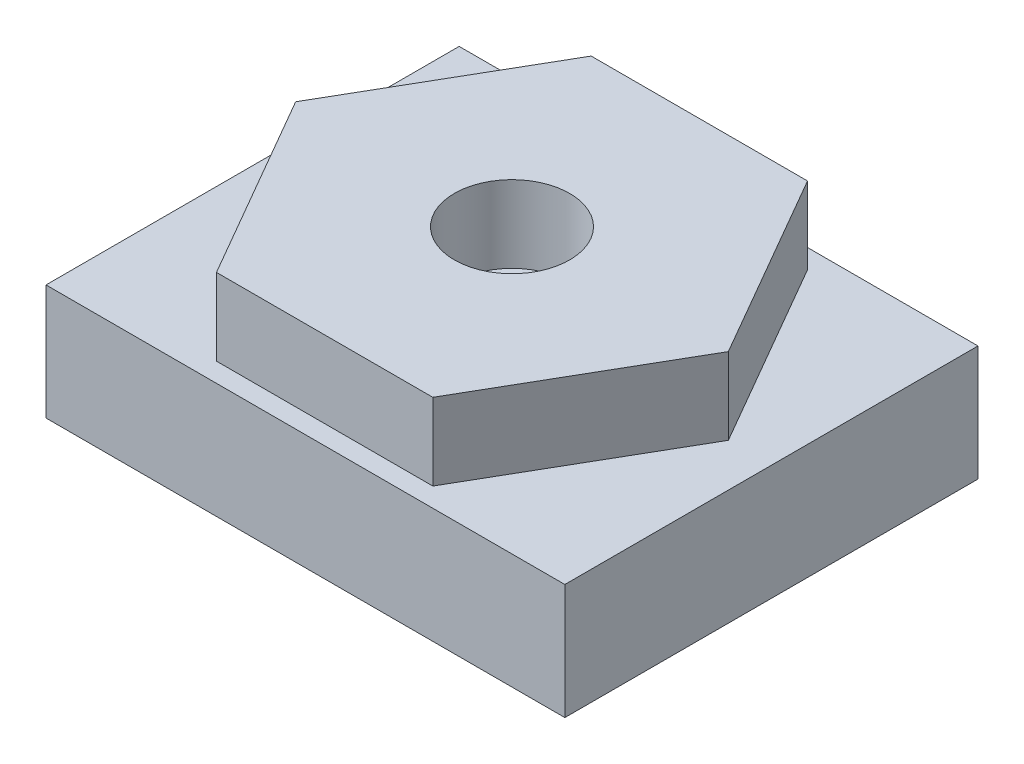
ISO-10303-21;
HEADER;
FILE_DESCRIPTION(('STEP AP214'),'2;1');
FILE_NAME('part.step','',(''),(''),'','','');
FILE_SCHEMA(('AUTOMOTIVE_DESIGN { 1 0 10303 214 1 1 1 1 }'));
ENDSEC;
DATA;
#1=APPLICATION_CONTEXT('core data for automotive mechanical design processes');
#2=APPLICATION_PROTOCOL_DEFINITION('international standard','automotive_design',2000,#1);
#3=PRODUCT_CONTEXT('',#1,'mechanical');
#4=PRODUCT('Part','Part','',(#3));
#5=PRODUCT_RELATED_PRODUCT_CATEGORY('part','',(#4));
#6=PRODUCT_DEFINITION_FORMATION('','',#4);
#7=PRODUCT_DEFINITION_CONTEXT('part definition',#1,'design');
#8=PRODUCT_DEFINITION('design','',#6,#7);
#9=PRODUCT_DEFINITION_SHAPE('','',#8);
#10=(LENGTH_UNIT() NAMED_UNIT(*) SI_UNIT(.MILLI.,.METRE.));
#11=(NAMED_UNIT(*) PLANE_ANGLE_UNIT() SI_UNIT($,.RADIAN.));
#12=(NAMED_UNIT(*) SI_UNIT($,.STERADIAN.) SOLID_ANGLE_UNIT());
#13=UNCERTAINTY_MEASURE_WITH_UNIT(LENGTH_MEASURE(1.E-05),#10,'distance_accuracy_value','');
#14=(GEOMETRIC_REPRESENTATION_CONTEXT(3) GLOBAL_UNCERTAINTY_ASSIGNED_CONTEXT((#13)) GLOBAL_UNIT_ASSIGNED_CONTEXT((#10,
#11,#12)) REPRESENTATION_CONTEXT('',''));
#15=CARTESIAN_POINT('',(0.,0.,0.));
#16=DIRECTION('',(0.,0.,1.));
#17=DIRECTION('',(1.,0.,0.));
#18=AXIS2_PLACEMENT_3D('',#15,#16,#17);
#19=CARTESIAN_POINT('',(-27.,12.,-21.4999999999996));
#20=DIRECTION('',(0.,1.,0.));
#21=DIRECTION('',(0.,0.,1.));
#22=AXIS2_PLACEMENT_3D('',#19,#20,#21);
#23=PLANE('',#22);
#24=DIRECTION('',(0.,0.,1.));
#25=VECTOR('',#24,1.);
#26=CARTESIAN_POINT('',(-27.,12.,21.5000000000005));
#27=LINE('',#26,#25);
#28=CARTESIAN_POINT('',(-27.,12.,-21.4999999999996));
#29=VERTEX_POINT('',#28);
#30=CARTESIAN_POINT('',(-27.,12.,21.5000000000005));
#31=VERTEX_POINT('',#30);
#32=EDGE_CURVE('E150',#29,#31,#27,.T.);
#33=ORIENTED_EDGE('',*,*,#32,.T.);
#34=DIRECTION('',(1.,0.,0.));
#35=VECTOR('',#34,1.);
#36=CARTESIAN_POINT('',(27.,12.,21.5000000000005));
#37=LINE('',#36,#35);
#38=CARTESIAN_POINT('',(27.,12.,21.5000000000005));
#39=VERTEX_POINT('',#38);
#40=EDGE_CURVE('E82',#31,#39,#37,.T.);
#41=ORIENTED_EDGE('',*,*,#40,.T.);
#42=DIRECTION('',(0.,0.,-1.));
#43=VECTOR('',#42,1.);
#44=CARTESIAN_POINT('',(27.,12.,21.5000000000005));
#45=LINE('',#44,#43);
#46=CARTESIAN_POINT('',(27.,12.,-21.4999999999996));
#47=VERTEX_POINT('',#46);
#48=EDGE_CURVE('E153',#39,#47,#45,.T.);
#49=ORIENTED_EDGE('',*,*,#48,.T.);
#50=DIRECTION('',(-1.,0.,0.));
#51=VECTOR('',#50,1.);
#52=CARTESIAN_POINT('',(27.,12.,-21.4999999999996));
#53=LINE('',#52,#51);
#54=EDGE_CURVE('E54',#47,#29,#53,.T.);
#55=ORIENTED_EDGE('',*,*,#54,.T.);
#56=EDGE_LOOP('',(#33,#41,#49,#55));
#57=FACE_BOUND('',#56,.T.);
#58=DIRECTION('',(0.5,0.,0.866025403784439));
#59=VECTOR('',#58,1.);
#60=CARTESIAN_POINT('',(-22.5166604983954,12.,0.));
#61=LINE('',#60,#59);
#62=CARTESIAN_POINT('',(-22.5166604983954,12.,0.));
#63=VERTEX_POINT('',#62);
#64=CARTESIAN_POINT('',(-11.2583302491977,12.,19.5));
#65=VERTEX_POINT('',#64);
#66=EDGE_CURVE('E207',#63,#65,#61,.T.);
#67=ORIENTED_EDGE('',*,*,#66,.F.);
#68=DIRECTION('',(-0.5,0.,0.866025403784439));
#69=VECTOR('',#68,1.);
#70=CARTESIAN_POINT('',(-11.2583302491977,12.,-19.5));
#71=LINE('',#70,#69);
#72=CARTESIAN_POINT('',(-11.2583302491977,12.,-19.5));
#73=VERTEX_POINT('',#72);
#74=EDGE_CURVE('E139',#73,#63,#71,.T.);
#75=ORIENTED_EDGE('',*,*,#74,.F.);
#76=DIRECTION('',(-1.,0.,0.));
#77=VECTOR('',#76,1.);
#78=CARTESIAN_POINT('',(11.2583302491977,12.,-19.5));
#79=LINE('',#78,#77);
#80=CARTESIAN_POINT('',(11.2583302491977,12.,-19.5));
#81=VERTEX_POINT('',#80);
#82=EDGE_CURVE('E135',#81,#73,#79,.T.);
#83=ORIENTED_EDGE('',*,*,#82,.F.);
#84=DIRECTION('',(-0.5,0.,-0.866025403784439));
#85=VECTOR('',#84,1.);
#86=CARTESIAN_POINT('',(22.5166604983954,12.,0.));
#87=LINE('',#86,#85);
#88=CARTESIAN_POINT('',(22.5166604983954,12.,0.));
#89=VERTEX_POINT('',#88);
#90=EDGE_CURVE('E224',#89,#81,#87,.T.);
#91=ORIENTED_EDGE('',*,*,#90,.F.);
#92=DIRECTION('',(0.5,0.,-0.866025403784439));
#93=VECTOR('',#92,1.);
#94=CARTESIAN_POINT('',(11.2583302491977,12.,19.5));
#95=LINE('',#94,#93);
#96=CARTESIAN_POINT('',(11.2583302491977,12.,19.5));
#97=VERTEX_POINT('',#96);
#98=EDGE_CURVE('E222',#97,#89,#95,.T.);
#99=ORIENTED_EDGE('',*,*,#98,.F.);
#100=DIRECTION('',(1.,0.,0.));
#101=VECTOR('',#100,1.);
#102=CARTESIAN_POINT('',(-11.2583302491977,12.,19.5));
#103=LINE('',#102,#101);
#104=EDGE_CURVE('E220',#65,#97,#103,.T.);
#105=ORIENTED_EDGE('',*,*,#104,.F.);
#106=EDGE_LOOP('',(#67,#75,#83,#91,#99,#105));
#107=FACE_BOUND('',#106,.T.);
#108=ADVANCED_FACE('F30',(#57,#107),#23,.T.);
#109=CARTESIAN_POINT('',(-27.,12.,21.5000000000005));
#110=DIRECTION('',(1.,0.,0.));
#111=DIRECTION('',(0.,0.,-1.));
#112=AXIS2_PLACEMENT_3D('',#109,#110,#111);
#113=PLANE('',#112);
#114=DIRECTION('',(0.,0.,1.));
#115=VECTOR('',#114,1.);
#116=CARTESIAN_POINT('',(-27.,0.,21.5000000000005));
#117=LINE('',#116,#115);
#118=CARTESIAN_POINT('',(-27.,0.,-21.4999999999996));
#119=VERTEX_POINT('',#118);
#120=CARTESIAN_POINT('',(-27.,0.,21.5000000000005));
#121=VERTEX_POINT('',#120);
#122=EDGE_CURVE('E141',#119,#121,#117,.T.);
#123=ORIENTED_EDGE('',*,*,#122,.T.);
#124=DIRECTION('',(0.,-1.,0.));
#125=VECTOR('',#124,1.);
#126=CARTESIAN_POINT('',(-27.,12.,21.5000000000005));
#127=LINE('',#126,#125);
#128=EDGE_CURVE('E11',#31,#121,#127,.T.);
#129=ORIENTED_EDGE('',*,*,#128,.F.);
#130=ORIENTED_EDGE('',*,*,#32,.F.);
#131=DIRECTION('',(0.,-1.,0.));
#132=VECTOR('',#131,1.);
#133=CARTESIAN_POINT('',(-27.,12.,-21.4999999999996));
#134=LINE('',#133,#132);
#135=EDGE_CURVE('E155',#29,#119,#134,.T.);
#136=ORIENTED_EDGE('',*,*,#135,.T.);
#137=EDGE_LOOP('',(#123,#129,#130,#136));
#138=FACE_BOUND('',#137,.T.);
#139=ADVANCED_FACE('F32',(#138),#113,.F.);
#140=CARTESIAN_POINT('',(27.,12.,21.5000000000005));
#141=DIRECTION('',(0.,0.,-1.));
#142=DIRECTION('',(-1.,0.,0.));
#143=AXIS2_PLACEMENT_3D('',#140,#141,#142);
#144=PLANE('',#143);
#145=DIRECTION('',(1.,0.,0.));
#146=VECTOR('',#145,1.);
#147=CARTESIAN_POINT('',(27.,0.,21.5000000000005));
#148=LINE('',#147,#146);
#149=CARTESIAN_POINT('',(27.,0.,21.5000000000005));
#150=VERTEX_POINT('',#149);
#151=EDGE_CURVE('E144',#121,#150,#148,.T.);
#152=ORIENTED_EDGE('',*,*,#151,.T.);
#153=DIRECTION('',(0.,-1.,0.));
#154=VECTOR('',#153,1.);
#155=CARTESIAN_POINT('',(27.,12.,21.5000000000005));
#156=LINE('',#155,#154);
#157=EDGE_CURVE('E38',#39,#150,#156,.T.);
#158=ORIENTED_EDGE('',*,*,#157,.F.);
#159=ORIENTED_EDGE('',*,*,#40,.F.);
#160=ORIENTED_EDGE('',*,*,#128,.T.);
#161=EDGE_LOOP('',(#152,#158,#159,#160));
#162=FACE_BOUND('',#161,.T.);
#163=ADVANCED_FACE('F183',(#162),#144,.F.);
#164=CARTESIAN_POINT('',(27.,12.,21.5000000000005));
#165=DIRECTION('',(-1.,0.,0.));
#166=DIRECTION('',(0.,0.,1.));
#167=AXIS2_PLACEMENT_3D('',#164,#165,#166);
#168=PLANE('',#167);
#169=DIRECTION('',(0.,0.,-1.));
#170=VECTOR('',#169,1.);
#171=CARTESIAN_POINT('',(27.,0.,21.5000000000005));
#172=LINE('',#171,#170);
#173=CARTESIAN_POINT('',(27.,0.,-21.4999999999996));
#174=VERTEX_POINT('',#173);
#175=EDGE_CURVE('E158',#150,#174,#172,.T.);
#176=ORIENTED_EDGE('',*,*,#175,.T.);
#177=DIRECTION('',(0.,-1.,0.));
#178=VECTOR('',#177,1.);
#179=CARTESIAN_POINT('',(27.,12.,-21.4999999999996));
#180=LINE('',#179,#178);
#181=EDGE_CURVE('E162',#47,#174,#180,.T.);
#182=ORIENTED_EDGE('',*,*,#181,.F.);
#183=ORIENTED_EDGE('',*,*,#48,.F.);
#184=ORIENTED_EDGE('',*,*,#157,.T.);
#185=EDGE_LOOP('',(#176,#182,#183,#184));
#186=FACE_BOUND('',#185,.T.);
#187=ADVANCED_FACE('F167',(#186),#168,.F.);
#188=CARTESIAN_POINT('',(27.,12.,-21.4999999999996));
#189=DIRECTION('',(0.,0.,1.));
#190=DIRECTION('',(1.,0.,0.));
#191=AXIS2_PLACEMENT_3D('',#188,#189,#190);
#192=PLANE('',#191);
#193=DIRECTION('',(-1.,0.,0.));
#194=VECTOR('',#193,1.);
#195=CARTESIAN_POINT('',(27.,0.,-21.4999999999996));
#196=LINE('',#195,#194);
#197=EDGE_CURVE('E75',#174,#119,#196,.T.);
#198=ORIENTED_EDGE('',*,*,#197,.T.);
#199=ORIENTED_EDGE('',*,*,#135,.F.);
#200=ORIENTED_EDGE('',*,*,#54,.F.);
#201=ORIENTED_EDGE('',*,*,#181,.T.);
#202=EDGE_LOOP('',(#198,#199,#200,#201));
#203=FACE_BOUND('',#202,.T.);
#204=ADVANCED_FACE('F175',(#203),#192,.F.);
#205=CARTESIAN_POINT('',(-27.,0.,-21.4999999999996));
#206=DIRECTION('',(0.,1.,0.));
#207=DIRECTION('',(0.,0.,1.));
#208=AXIS2_PLACEMENT_3D('',#205,#206,#207);
#209=PLANE('',#208);
#210=ORIENTED_EDGE('',*,*,#122,.F.);
#211=ORIENTED_EDGE('',*,*,#197,.F.);
#212=ORIENTED_EDGE('',*,*,#175,.F.);
#213=ORIENTED_EDGE('',*,*,#151,.F.);
#214=EDGE_LOOP('',(#210,#211,#212,#213));
#215=FACE_BOUND('',#214,.T.);
#216=ADVANCED_FACE('F171',(#215),#209,.F.);
#217=CARTESIAN_POINT('',(-22.5166604983954,20.,0.));
#218=DIRECTION('',(0.,1.,0.));
#219=DIRECTION('',(0.,0.,1.));
#220=AXIS2_PLACEMENT_3D('',#217,#218,#219);
#221=PLANE('',#220);
#222=CARTESIAN_POINT('',(0.,20.,0.));
#223=DIRECTION('',(0.,1.,0.));
#224=DIRECTION('',(0.,0.,1.));
#225=AXIS2_PLACEMENT_3D('',#222,#223,#224);
#226=CIRCLE('',#225,6.);
#227=CARTESIAN_POINT('',(0.,20.,6.));
#228=VERTEX_POINT('',#227);
#229=EDGE_CURVE('E205',#228,#228,#226,.T.);
#230=ORIENTED_EDGE('',*,*,#229,.F.);
#231=EDGE_LOOP('',(#230));
#232=FACE_BOUND('',#231,.T.);
#233=DIRECTION('',(-0.5,0.,0.866025403784439));
#234=VECTOR('',#233,1.);
#235=CARTESIAN_POINT('',(-11.2583302491977,20.,-19.5));
#236=LINE('',#235,#234);
#237=CARTESIAN_POINT('',(-11.2583302491977,20.,-19.5));
#238=VERTEX_POINT('',#237);
#239=CARTESIAN_POINT('',(-22.5166604983954,20.,0.));
#240=VERTEX_POINT('',#239);
#241=EDGE_CURVE('E127',#238,#240,#236,.T.);
#242=ORIENTED_EDGE('',*,*,#241,.T.);
#243=DIRECTION('',(0.5,0.,0.866025403784439));
#244=VECTOR('',#243,1.);
#245=CARTESIAN_POINT('',(-22.5166604983954,20.,0.));
#246=LINE('',#245,#244);
#247=CARTESIAN_POINT('',(-11.2583302491977,20.,19.5));
#248=VERTEX_POINT('',#247);
#249=EDGE_CURVE('E116',#240,#248,#246,.T.);
#250=ORIENTED_EDGE('',*,*,#249,.T.);
#251=DIRECTION('',(1.,0.,0.));
#252=VECTOR('',#251,1.);
#253=CARTESIAN_POINT('',(-11.2583302491977,20.,19.5));
#254=LINE('',#253,#252);
#255=CARTESIAN_POINT('',(11.2583302491977,20.,19.5));
#256=VERTEX_POINT('',#255);
#257=EDGE_CURVE('E126',#248,#256,#254,.T.);
#258=ORIENTED_EDGE('',*,*,#257,.T.);
#259=DIRECTION('',(0.5,0.,-0.866025403784439));
#260=VECTOR('',#259,1.);
#261=CARTESIAN_POINT('',(11.2583302491977,20.,19.5));
#262=LINE('',#261,#260);
#263=CARTESIAN_POINT('',(22.5166604983954,20.,0.));
#264=VERTEX_POINT('',#263);
#265=EDGE_CURVE('E213',#256,#264,#262,.T.);
#266=ORIENTED_EDGE('',*,*,#265,.T.);
#267=DIRECTION('',(-0.5,0.,-0.866025403784439));
#268=VECTOR('',#267,1.);
#269=CARTESIAN_POINT('',(22.5166604983954,20.,0.));
#270=LINE('',#269,#268);
#271=CARTESIAN_POINT('',(11.2583302491977,20.,-19.5));
#272=VERTEX_POINT('',#271);
#273=EDGE_CURVE('E215',#264,#272,#270,.T.);
#274=ORIENTED_EDGE('',*,*,#273,.T.);
#275=DIRECTION('',(-1.,0.,0.));
#276=VECTOR('',#275,1.);
#277=CARTESIAN_POINT('',(11.2583302491977,20.,-19.5));
#278=LINE('',#277,#276);
#279=EDGE_CURVE('E131',#272,#238,#278,.T.);
#280=ORIENTED_EDGE('',*,*,#279,.T.);
#281=EDGE_LOOP('',(#242,#250,#258,#266,#274,#280));
#282=FACE_BOUND('',#281,.T.);
#283=ADVANCED_FACE('F130',(#232,#282),#221,.T.);
#284=CARTESIAN_POINT('',(-11.2583302491977,20.,-19.5));
#285=DIRECTION('',(0.866025403784438,0.,0.5));
#286=DIRECTION('',(0.5,0.,-0.866025403784439));
#287=AXIS2_PLACEMENT_3D('',#284,#285,#286);
#288=PLANE('',#287);
#289=ORIENTED_EDGE('',*,*,#74,.T.);
#290=DIRECTION('',(0.,-1.,0.));
#291=VECTOR('',#290,1.);
#292=CARTESIAN_POINT('',(-22.5166604983954,20.,0.));
#293=LINE('',#292,#291);
#294=EDGE_CURVE('E120',#240,#63,#293,.T.);
#295=ORIENTED_EDGE('',*,*,#294,.F.);
#296=ORIENTED_EDGE('',*,*,#241,.F.);
#297=DIRECTION('',(0.,-1.,0.));
#298=VECTOR('',#297,1.);
#299=CARTESIAN_POINT('',(-11.2583302491977,20.,-19.5));
#300=LINE('',#299,#298);
#301=EDGE_CURVE('E217',#238,#73,#300,.T.);
#302=ORIENTED_EDGE('',*,*,#301,.T.);
#303=EDGE_LOOP('',(#289,#295,#296,#302));
#304=FACE_BOUND('',#303,.T.);
#305=ADVANCED_FACE('F137',(#304),#288,.F.);
#306=CARTESIAN_POINT('',(-22.5166604983954,20.,0.));
#307=DIRECTION('',(0.866025403784439,0.,-0.5));
#308=DIRECTION('',(-0.5,0.,-0.866025403784439));
#309=AXIS2_PLACEMENT_3D('',#306,#307,#308);
#310=PLANE('',#309);
#311=ORIENTED_EDGE('',*,*,#66,.T.);
#312=DIRECTION('',(0.,-1.,0.));
#313=VECTOR('',#312,1.);
#314=CARTESIAN_POINT('',(-11.2583302491977,20.,19.5));
#315=LINE('',#314,#313);
#316=EDGE_CURVE('E123',#248,#65,#315,.T.);
#317=ORIENTED_EDGE('',*,*,#316,.F.);
#318=ORIENTED_EDGE('',*,*,#249,.F.);
#319=ORIENTED_EDGE('',*,*,#294,.T.);
#320=EDGE_LOOP('',(#311,#317,#318,#319));
#321=FACE_BOUND('',#320,.T.);
#322=ADVANCED_FACE('F118',(#321),#310,.F.);
#323=CARTESIAN_POINT('',(-11.2583302491977,20.,19.5));
#324=DIRECTION('',(0.,0.,-1.));
#325=DIRECTION('',(-1.,0.,0.));
#326=AXIS2_PLACEMENT_3D('',#323,#324,#325);
#327=PLANE('',#326);
#328=ORIENTED_EDGE('',*,*,#104,.T.);
#329=DIRECTION('',(0.,-1.,0.));
#330=VECTOR('',#329,1.);
#331=CARTESIAN_POINT('',(11.2583302491977,20.,19.5));
#332=LINE('',#331,#330);
#333=EDGE_CURVE('E146',#256,#97,#332,.T.);
#334=ORIENTED_EDGE('',*,*,#333,.F.);
#335=ORIENTED_EDGE('',*,*,#257,.F.);
#336=ORIENTED_EDGE('',*,*,#316,.T.);
#337=EDGE_LOOP('',(#328,#334,#335,#336));
#338=FACE_BOUND('',#337,.T.);
#339=ADVANCED_FACE('F245',(#338),#327,.F.);
#340=CARTESIAN_POINT('',(11.2583302491977,20.,19.5));
#341=DIRECTION('',(-0.866025403784439,0.,-0.5));
#342=DIRECTION('',(-0.5,0.,0.866025403784439));
#343=AXIS2_PLACEMENT_3D('',#340,#341,#342);
#344=PLANE('',#343);
#345=ORIENTED_EDGE('',*,*,#98,.T.);
#346=DIRECTION('',(0.,-1.,0.));
#347=VECTOR('',#346,1.);
#348=CARTESIAN_POINT('',(22.5166604983954,20.,0.));
#349=LINE('',#348,#347);
#350=EDGE_CURVE('E229',#264,#89,#349,.T.);
#351=ORIENTED_EDGE('',*,*,#350,.F.);
#352=ORIENTED_EDGE('',*,*,#265,.F.);
#353=ORIENTED_EDGE('',*,*,#333,.T.);
#354=EDGE_LOOP('',(#345,#351,#352,#353));
#355=FACE_BOUND('',#354,.T.);
#356=ADVANCED_FACE('F236',(#355),#344,.F.);
#357=CARTESIAN_POINT('',(22.5166604983954,20.,0.));
#358=DIRECTION('',(-0.866025403784439,0.,0.5));
#359=DIRECTION('',(0.5,0.,0.866025403784439));
#360=AXIS2_PLACEMENT_3D('',#357,#358,#359);
#361=PLANE('',#360);
#362=ORIENTED_EDGE('',*,*,#90,.T.);
#363=DIRECTION('',(0.,-1.,0.));
#364=VECTOR('',#363,1.);
#365=CARTESIAN_POINT('',(11.2583302491977,20.,-19.5));
#366=LINE('',#365,#364);
#367=EDGE_CURVE('E45',#272,#81,#366,.T.);
#368=ORIENTED_EDGE('',*,*,#367,.F.);
#369=ORIENTED_EDGE('',*,*,#273,.F.);
#370=ORIENTED_EDGE('',*,*,#350,.T.);
#371=EDGE_LOOP('',(#362,#368,#369,#370));
#372=FACE_BOUND('',#371,.T.);
#373=ADVANCED_FACE('F243',(#372),#361,.F.);
#374=CARTESIAN_POINT('',(11.2583302491977,20.,-19.5));
#375=DIRECTION('',(0.,0.,1.));
#376=DIRECTION('',(1.,0.,0.));
#377=AXIS2_PLACEMENT_3D('',#374,#375,#376);
#378=PLANE('',#377);
#379=ORIENTED_EDGE('',*,*,#82,.T.);
#380=ORIENTED_EDGE('',*,*,#301,.F.);
#381=ORIENTED_EDGE('',*,*,#279,.F.);
#382=ORIENTED_EDGE('',*,*,#367,.T.);
#383=EDGE_LOOP('',(#379,#380,#381,#382));
#384=FACE_BOUND('',#383,.T.);
#385=ADVANCED_FACE('F199',(#384),#378,.F.);
#386=CARTESIAN_POINT('',(0.,12.,0.));
#387=DIRECTION('',(0.,1.,0.));
#388=DIRECTION('',(0.,0.,1.));
#389=AXIS2_PLACEMENT_3D('',#386,#387,#388);
#390=CYLINDRICAL_SURFACE('',#389,6.);
#391=CARTESIAN_POINT('',(0.,12.,0.));
#392=DIRECTION('',(0.,1.,0.));
#393=DIRECTION('',(0.,0.,1.));
#394=AXIS2_PLACEMENT_3D('',#391,#392,#393);
#395=CIRCLE('',#394,6.);
#396=CARTESIAN_POINT('',(0.,12.,6.));
#397=VERTEX_POINT('',#396);
#398=EDGE_CURVE('E204',#397,#397,#395,.T.);
#399=ORIENTED_EDGE('',*,*,#398,.F.);
#400=EDGE_LOOP('',(#399));
#401=FACE_BOUND('',#400,.T.);
#402=ORIENTED_EDGE('',*,*,#229,.T.);
#403=EDGE_LOOP('',(#402));
#404=FACE_BOUND('',#403,.T.);
#405=ADVANCED_FACE('F194',(#401,#404),#390,.F.);
#406=ORIENTED_EDGE('',*,*,#398,.T.);
#407=EDGE_LOOP('',(#406));
#408=FACE_BOUND('',#407,.T.);
#409=ADVANCED_FACE('F187',(#408),#23,.T.);
#410=CLOSED_SHELL('',(#108,#139,#163,#187,#204,#216,#283,#305,#322,#339,#356,#373,#385,#405,#409));
#411=MANIFOLD_SOLID_BREP('B2',#410);
#412=ADVANCED_BREP_SHAPE_REPRESENTATION('',(#18,#411),#14);
#413=SHAPE_DEFINITION_REPRESENTATION(#9,#412);
ENDSEC;
END-ISO-10303-21;
